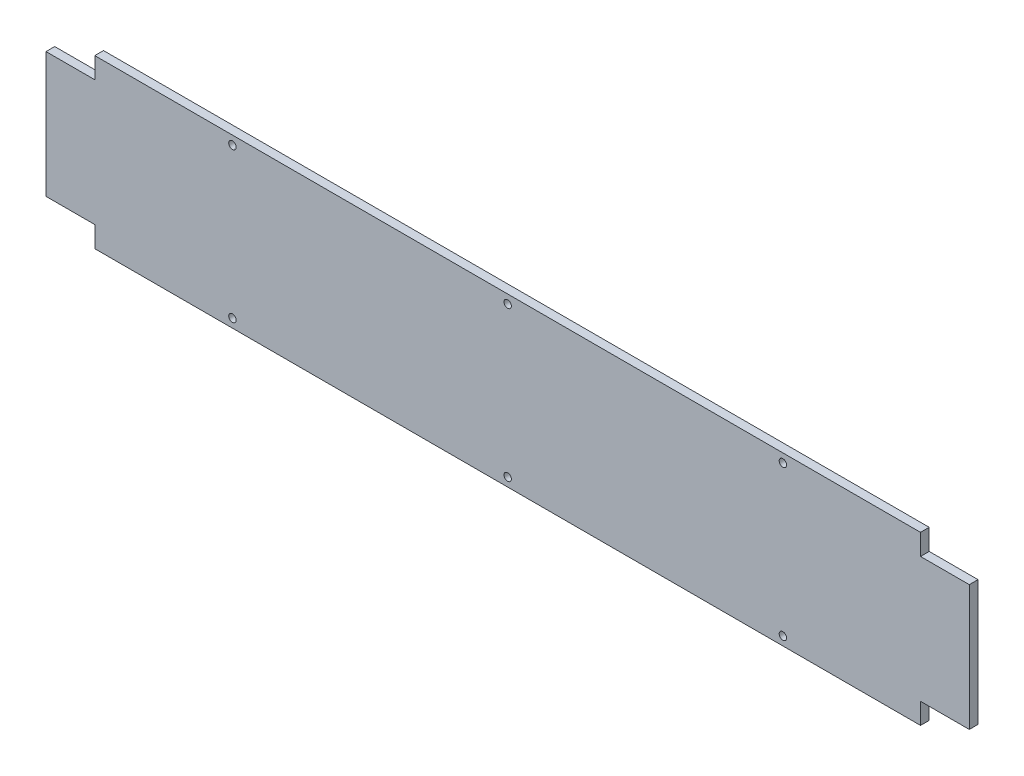
ISO-10303-21;
HEADER;
FILE_DESCRIPTION(('STEP AP214'),'2;1');
FILE_NAME('part.step','',(''),(''),'','','');
FILE_SCHEMA(('AUTOMOTIVE_DESIGN { 1 0 10303 214 1 1 1 1 }'));
ENDSEC;
DATA;
#1=APPLICATION_CONTEXT('core data for automotive mechanical design processes');
#2=APPLICATION_PROTOCOL_DEFINITION('international standard','automotive_design',2000,#1);
#3=PRODUCT_CONTEXT('',#1,'mechanical');
#4=PRODUCT('Part','Part','',(#3));
#5=PRODUCT_RELATED_PRODUCT_CATEGORY('part','',(#4));
#6=PRODUCT_DEFINITION_FORMATION('','',#4);
#7=PRODUCT_DEFINITION_CONTEXT('part definition',#1,'design');
#8=PRODUCT_DEFINITION('design','',#6,#7);
#9=PRODUCT_DEFINITION_SHAPE('','',#8);
#10=(LENGTH_UNIT() NAMED_UNIT(*) SI_UNIT(.MILLI.,.METRE.));
#11=(NAMED_UNIT(*) PLANE_ANGLE_UNIT() SI_UNIT($,.RADIAN.));
#12=(NAMED_UNIT(*) SI_UNIT($,.STERADIAN.) SOLID_ANGLE_UNIT());
#13=UNCERTAINTY_MEASURE_WITH_UNIT(LENGTH_MEASURE(1.E-05),#10,'distance_accuracy_value','');
#14=(GEOMETRIC_REPRESENTATION_CONTEXT(3) GLOBAL_UNCERTAINTY_ASSIGNED_CONTEXT((#13)) GLOBAL_UNIT_ASSIGNED_CONTEXT((#10,
#11,#12)) REPRESENTATION_CONTEXT('',''));
#15=CARTESIAN_POINT('',(0.,0.,0.));
#16=DIRECTION('',(0.,0.,1.));
#17=DIRECTION('',(1.,0.,0.));
#18=AXIS2_PLACEMENT_3D('',#15,#16,#17);
#19=CARTESIAN_POINT('',(0.,0.,5.));
#20=DIRECTION('',(1.,0.,0.));
#21=DIRECTION('',(0.,0.,-1.));
#22=AXIS2_PLACEMENT_3D('',#19,#20,#21);
#23=PLANE('',#22);
#24=DIRECTION('',(0.,0.,1.));
#25=VECTOR('',#24,1.);
#26=CARTESIAN_POINT('',(0.,12.,0.));
#27=LINE('',#26,#25);
#28=CARTESIAN_POINT('',(0.,12.,0.));
#29=VERTEX_POINT('',#28);
#30=CARTESIAN_POINT('',(0.,12.,5.));
#31=VERTEX_POINT('',#30);
#32=EDGE_CURVE('E135',#29,#31,#27,.T.);
#33=ORIENTED_EDGE('',*,*,#32,.F.);
#34=DIRECTION('',(0.,-1.,0.));
#35=VECTOR('',#34,1.);
#36=CARTESIAN_POINT('',(0.,0.,0.));
#37=LINE('',#36,#35);
#38=CARTESIAN_POINT('',(0.,0.,0.));
#39=VERTEX_POINT('',#38);
#40=EDGE_CURVE('E188',#29,#39,#37,.T.);
#41=ORIENTED_EDGE('',*,*,#40,.T.);
#42=DIRECTION('',(0.,0.,-1.));
#43=VECTOR('',#42,1.);
#44=CARTESIAN_POINT('',(0.,0.,5.));
#45=LINE('',#44,#43);
#46=CARTESIAN_POINT('',(0.,0.,5.));
#47=VERTEX_POINT('',#46);
#48=EDGE_CURVE('E11',#47,#39,#45,.T.);
#49=ORIENTED_EDGE('',*,*,#48,.F.);
#50=DIRECTION('',(0.,-1.,0.));
#51=VECTOR('',#50,1.);
#52=CARTESIAN_POINT('',(0.,0.,5.));
#53=LINE('',#52,#51);
#54=EDGE_CURVE('E151',#31,#47,#53,.T.);
#55=ORIENTED_EDGE('',*,*,#54,.F.);
#56=EDGE_LOOP('',(#33,#41,#49,#55));
#57=FACE_BOUND('',#56,.T.);
#58=ADVANCED_FACE('F45',(#57),#23,.F.);
#59=CARTESIAN_POINT('',(474.,0.,5.));
#60=DIRECTION('',(-1.,0.,0.));
#61=DIRECTION('',(0.,0.,1.));
#62=AXIS2_PLACEMENT_3D('',#59,#60,#61);
#63=PLANE('',#62);
#64=DIRECTION('',(0.,0.,1.));
#65=VECTOR('',#64,1.);
#66=CARTESIAN_POINT('',(474.,84.,0.));
#67=LINE('',#66,#65);
#68=CARTESIAN_POINT('',(474.,84.,0.));
#69=VERTEX_POINT('',#68);
#70=CARTESIAN_POINT('',(474.,84.,5.));
#71=VERTEX_POINT('',#70);
#72=EDGE_CURVE('E241',#69,#71,#67,.T.);
#73=ORIENTED_EDGE('',*,*,#72,.F.);
#74=DIRECTION('',(0.,1.,0.));
#75=VECTOR('',#74,1.);
#76=CARTESIAN_POINT('',(474.,0.,0.));
#77=LINE('',#76,#75);
#78=CARTESIAN_POINT('',(474.,96.,0.));
#79=VERTEX_POINT('',#78);
#80=EDGE_CURVE('E191',#69,#79,#77,.T.);
#81=ORIENTED_EDGE('',*,*,#80,.T.);
#82=DIRECTION('',(0.,0.,-1.));
#83=VECTOR('',#82,1.);
#84=CARTESIAN_POINT('',(474.,96.,5.));
#85=LINE('',#84,#83);
#86=CARTESIAN_POINT('',(474.,96.,5.));
#87=VERTEX_POINT('',#86);
#88=EDGE_CURVE('E198',#87,#79,#85,.T.);
#89=ORIENTED_EDGE('',*,*,#88,.F.);
#90=DIRECTION('',(0.,1.,0.));
#91=VECTOR('',#90,1.);
#92=CARTESIAN_POINT('',(474.,0.,5.));
#93=LINE('',#92,#91);
#94=EDGE_CURVE('E174',#71,#87,#93,.T.);
#95=ORIENTED_EDGE('',*,*,#94,.F.);
#96=EDGE_LOOP('',(#73,#81,#89,#95));
#97=FACE_BOUND('',#96,.T.);
#98=ADVANCED_FACE('F320',(#97),#63,.F.);
#99=CARTESIAN_POINT('',(0.,96.,0.));
#100=VERTEX_POINT('',#99);
#101=CARTESIAN_POINT('',(0.,84.,0.));
#102=VERTEX_POINT('',#101);
#103=EDGE_CURVE('E183',#100,#102,#37,.T.);
#104=ORIENTED_EDGE('',*,*,#103,.T.);
#105=DIRECTION('',(0.,0.,1.));
#106=VECTOR('',#105,1.);
#107=CARTESIAN_POINT('',(0.,84.,0.));
#108=LINE('',#107,#106);
#109=CARTESIAN_POINT('',(0.,84.,5.));
#110=VERTEX_POINT('',#109);
#111=EDGE_CURVE('E334',#102,#110,#108,.T.);
#112=ORIENTED_EDGE('',*,*,#111,.T.);
#113=CARTESIAN_POINT('',(0.,96.,5.));
#114=VERTEX_POINT('',#113);
#115=EDGE_CURVE('E160',#114,#110,#53,.T.);
#116=ORIENTED_EDGE('',*,*,#115,.F.);
#117=DIRECTION('',(0.,0.,-1.));
#118=VECTOR('',#117,1.);
#119=CARTESIAN_POINT('',(0.,96.,5.));
#120=LINE('',#119,#118);
#121=EDGE_CURVE('E182',#114,#100,#120,.T.);
#122=ORIENTED_EDGE('',*,*,#121,.T.);
#123=EDGE_LOOP('',(#104,#112,#116,#122));
#124=FACE_BOUND('',#123,.T.);
#125=ADVANCED_FACE('F47',(#124),#23,.F.);
#126=CARTESIAN_POINT('',(0.,0.,5.));
#127=DIRECTION('',(0.,1.,0.));
#128=DIRECTION('',(0.,0.,1.));
#129=AXIS2_PLACEMENT_3D('',#126,#127,#128);
#130=PLANE('',#129);
#131=DIRECTION('',(1.,0.,0.));
#132=VECTOR('',#131,1.);
#133=CARTESIAN_POINT('',(0.,0.,0.));
#134=LINE('',#133,#132);
#135=CARTESIAN_POINT('',(474.,0.,0.));
#136=VERTEX_POINT('',#135);
#137=EDGE_CURVE('E187',#39,#136,#134,.T.);
#138=ORIENTED_EDGE('',*,*,#137,.T.);
#139=DIRECTION('',(0.,0.,-1.));
#140=VECTOR('',#139,1.);
#141=CARTESIAN_POINT('',(474.,0.,5.));
#142=LINE('',#141,#140);
#143=CARTESIAN_POINT('',(474.,0.,5.));
#144=VERTEX_POINT('',#143);
#145=EDGE_CURVE('E54',#144,#136,#142,.T.);
#146=ORIENTED_EDGE('',*,*,#145,.F.);
#147=DIRECTION('',(1.,0.,0.));
#148=VECTOR('',#147,1.);
#149=CARTESIAN_POINT('',(0.,0.,5.));
#150=LINE('',#149,#148);
#151=EDGE_CURVE('E165',#47,#144,#150,.T.);
#152=ORIENTED_EDGE('',*,*,#151,.F.);
#153=ORIENTED_EDGE('',*,*,#48,.T.);
#154=EDGE_LOOP('',(#138,#146,#152,#153));
#155=FACE_BOUND('',#154,.T.);
#156=ADVANCED_FACE('F328',(#155),#130,.F.);
#157=CARTESIAN_POINT('',(474.,12.,0.));
#158=VERTEX_POINT('',#157);
#159=EDGE_CURVE('E166',#136,#158,#77,.T.);
#160=ORIENTED_EDGE('',*,*,#159,.T.);
#161=DIRECTION('',(0.,0.,1.));
#162=VECTOR('',#161,1.);
#163=CARTESIAN_POINT('',(474.,12.,0.));
#164=LINE('',#163,#162);
#165=CARTESIAN_POINT('',(474.,12.,5.));
#166=VERTEX_POINT('',#165);
#167=EDGE_CURVE('E235',#158,#166,#164,.T.);
#168=ORIENTED_EDGE('',*,*,#167,.T.);
#169=EDGE_CURVE('E175',#144,#166,#93,.T.);
#170=ORIENTED_EDGE('',*,*,#169,.F.);
#171=ORIENTED_EDGE('',*,*,#145,.T.);
#172=EDGE_LOOP('',(#160,#168,#170,#171));
#173=FACE_BOUND('',#172,.T.);
#174=ADVANCED_FACE('F207',(#173),#63,.F.);
#175=CARTESIAN_POINT('',(0.,96.,5.));
#176=DIRECTION('',(0.,-1.,0.));
#177=DIRECTION('',(0.,0.,-1.));
#178=AXIS2_PLACEMENT_3D('',#175,#176,#177);
#179=PLANE('',#178);
#180=DIRECTION('',(-1.,0.,0.));
#181=VECTOR('',#180,1.);
#182=CARTESIAN_POINT('',(0.,96.,0.));
#183=LINE('',#182,#181);
#184=EDGE_CURVE('E161',#79,#100,#183,.T.);
#185=ORIENTED_EDGE('',*,*,#184,.T.);
#186=ORIENTED_EDGE('',*,*,#121,.F.);
#187=DIRECTION('',(-1.,0.,0.));
#188=VECTOR('',#187,1.);
#189=CARTESIAN_POINT('',(0.,96.,5.));
#190=LINE('',#189,#188);
#191=EDGE_CURVE('E179',#87,#114,#190,.T.);
#192=ORIENTED_EDGE('',*,*,#191,.F.);
#193=ORIENTED_EDGE('',*,*,#88,.T.);
#194=EDGE_LOOP('',(#185,#186,#192,#193));
#195=FACE_BOUND('',#194,.T.);
#196=ADVANCED_FACE('F304',(#195),#179,.F.);
#197=CARTESIAN_POINT('',(0.,0.,5.));
#198=DIRECTION('',(0.,0.,-1.));
#199=DIRECTION('',(-1.,0.,0.));
#200=AXIS2_PLACEMENT_3D('',#197,#198,#199);
#201=PLANE('',#200);
#202=CARTESIAN_POINT('',(79.,5.,5.));
#203=DIRECTION('',(0.,0.,1.));
#204=DIRECTION('',(-1.,0.,0.));
#205=AXIS2_PLACEMENT_3D('',#202,#203,#204);
#206=CIRCLE('',#205,2.125);
#207=CARTESIAN_POINT('',(76.875,5.,5.));
#208=VERTEX_POINT('',#207);
#209=EDGE_CURVE('E285',#208,#208,#206,.T.);
#210=ORIENTED_EDGE('',*,*,#209,.F.);
#211=EDGE_LOOP('',(#210));
#212=FACE_BOUND('',#211,.T.);
#213=CARTESIAN_POINT('',(237.,5.,5.));
#214=DIRECTION('',(0.,0.,1.));
#215=DIRECTION('',(-1.,0.,0.));
#216=AXIS2_PLACEMENT_3D('',#213,#214,#215);
#217=CIRCLE('',#216,2.12499999999998);
#218=CARTESIAN_POINT('',(234.875,5.,5.));
#219=VERTEX_POINT('',#218);
#220=EDGE_CURVE('E277',#219,#219,#217,.T.);
#221=ORIENTED_EDGE('',*,*,#220,.F.);
#222=EDGE_LOOP('',(#221));
#223=FACE_BOUND('',#222,.T.);
#224=CARTESIAN_POINT('',(395.,5.,5.));
#225=DIRECTION('',(0.,0.,1.));
#226=DIRECTION('',(-1.,0.,0.));
#227=AXIS2_PLACEMENT_3D('',#224,#225,#226);
#228=CIRCLE('',#227,2.125);
#229=CARTESIAN_POINT('',(392.875,5.,5.));
#230=VERTEX_POINT('',#229);
#231=EDGE_CURVE('E269',#230,#230,#228,.T.);
#232=ORIENTED_EDGE('',*,*,#231,.F.);
#233=EDGE_LOOP('',(#232));
#234=FACE_BOUND('',#233,.T.);
#235=CARTESIAN_POINT('',(395.,91.,5.));
#236=DIRECTION('',(0.,0.,1.));
#237=DIRECTION('',(1.,0.,0.));
#238=AXIS2_PLACEMENT_3D('',#235,#236,#237);
#239=CIRCLE('',#238,2.125);
#240=CARTESIAN_POINT('',(397.125,91.,5.));
#241=VERTEX_POINT('',#240);
#242=EDGE_CURVE('E261',#241,#241,#239,.T.);
#243=ORIENTED_EDGE('',*,*,#242,.F.);
#244=EDGE_LOOP('',(#243));
#245=FACE_BOUND('',#244,.T.);
#246=CARTESIAN_POINT('',(237.,91.,5.));
#247=DIRECTION('',(0.,0.,1.));
#248=DIRECTION('',(1.,0.,0.));
#249=AXIS2_PLACEMENT_3D('',#246,#247,#248);
#250=CIRCLE('',#249,2.12499999999998);
#251=CARTESIAN_POINT('',(239.125,91.,5.));
#252=VERTEX_POINT('',#251);
#253=EDGE_CURVE('E253',#252,#252,#250,.T.);
#254=ORIENTED_EDGE('',*,*,#253,.F.);
#255=EDGE_LOOP('',(#254));
#256=FACE_BOUND('',#255,.T.);
#257=CARTESIAN_POINT('',(79.,91.,5.));
#258=DIRECTION('',(0.,0.,1.));
#259=DIRECTION('',(1.,0.,0.));
#260=AXIS2_PLACEMENT_3D('',#257,#258,#259);
#261=CIRCLE('',#260,2.125);
#262=CARTESIAN_POINT('',(81.125,91.,5.));
#263=VERTEX_POINT('',#262);
#264=EDGE_CURVE('E170',#263,#263,#261,.T.);
#265=ORIENTED_EDGE('',*,*,#264,.F.);
#266=EDGE_LOOP('',(#265));
#267=FACE_BOUND('',#266,.T.);
#268=ORIENTED_EDGE('',*,*,#115,.T.);
#269=DIRECTION('',(-1.,0.,0.));
#270=VECTOR('',#269,1.);
#271=CARTESIAN_POINT('',(0.,84.,5.));
#272=LINE('',#271,#270);
#273=CARTESIAN_POINT('',(-28.,84.,5.));
#274=VERTEX_POINT('',#273);
#275=EDGE_CURVE('E61',#110,#274,#272,.T.);
#276=ORIENTED_EDGE('',*,*,#275,.T.);
#277=DIRECTION('',(0.,-1.,0.));
#278=VECTOR('',#277,1.);
#279=CARTESIAN_POINT('',(-28.,84.,5.));
#280=LINE('',#279,#278);
#281=CARTESIAN_POINT('',(-28.,12.,5.));
#282=VERTEX_POINT('',#281);
#283=EDGE_CURVE('E154',#274,#282,#280,.T.);
#284=ORIENTED_EDGE('',*,*,#283,.T.);
#285=DIRECTION('',(1.,0.,0.));
#286=VECTOR('',#285,1.);
#287=CARTESIAN_POINT('',(0.,12.,5.));
#288=LINE('',#287,#286);
#289=EDGE_CURVE('E138',#282,#31,#288,.T.);
#290=ORIENTED_EDGE('',*,*,#289,.T.);
#291=ORIENTED_EDGE('',*,*,#54,.T.);
#292=ORIENTED_EDGE('',*,*,#151,.T.);
#293=ORIENTED_EDGE('',*,*,#169,.T.);
#294=DIRECTION('',(1.,0.,0.));
#295=VECTOR('',#294,1.);
#296=CARTESIAN_POINT('',(474.,12.,5.));
#297=LINE('',#296,#295);
#298=CARTESIAN_POINT('',(502.,12.,5.));
#299=VERTEX_POINT('',#298);
#300=EDGE_CURVE('E69',#166,#299,#297,.T.);
#301=ORIENTED_EDGE('',*,*,#300,.T.);
#302=DIRECTION('',(0.,1.,0.));
#303=VECTOR('',#302,1.);
#304=CARTESIAN_POINT('',(502.,84.,5.));
#305=LINE('',#304,#303);
#306=CARTESIAN_POINT('',(502.,84.,5.));
#307=VERTEX_POINT('',#306);
#308=EDGE_CURVE('E228',#299,#307,#305,.T.);
#309=ORIENTED_EDGE('',*,*,#308,.T.);
#310=DIRECTION('',(-1.,0.,0.));
#311=VECTOR('',#310,1.);
#312=CARTESIAN_POINT('',(474.,84.,5.));
#313=LINE('',#312,#311);
#314=EDGE_CURVE('E221',#307,#71,#313,.T.);
#315=ORIENTED_EDGE('',*,*,#314,.T.);
#316=ORIENTED_EDGE('',*,*,#94,.T.);
#317=ORIENTED_EDGE('',*,*,#191,.T.);
#318=EDGE_LOOP('',(#268,#276,#284,#290,#291,#292,#293,#301,#309,#315,#316,#317));
#319=FACE_BOUND('',#318,.T.);
#320=ADVANCED_FACE('F150',(#212,#223,#234,#245,#256,#267,#319),#201,.F.);
#321=CARTESIAN_POINT('',(0.,0.,0.));
#322=DIRECTION('',(0.,0.,-1.));
#323=DIRECTION('',(-1.,0.,0.));
#324=AXIS2_PLACEMENT_3D('',#321,#322,#323);
#325=PLANE('',#324);
#326=CARTESIAN_POINT('',(79.,5.,0.));
#327=DIRECTION('',(0.,0.,1.));
#328=DIRECTION('',(-1.,0.,0.));
#329=AXIS2_PLACEMENT_3D('',#326,#327,#328);
#330=CIRCLE('',#329,2.125);
#331=CARTESIAN_POINT('',(76.875,5.,0.));
#332=VERTEX_POINT('',#331);
#333=EDGE_CURVE('E244',#332,#332,#330,.T.);
#334=ORIENTED_EDGE('',*,*,#333,.T.);
#335=EDGE_LOOP('',(#334));
#336=FACE_BOUND('',#335,.T.);
#337=CARTESIAN_POINT('',(237.,5.,0.));
#338=DIRECTION('',(0.,0.,1.));
#339=DIRECTION('',(-1.,0.,0.));
#340=AXIS2_PLACEMENT_3D('',#337,#338,#339);
#341=CIRCLE('',#340,2.12499999999998);
#342=CARTESIAN_POINT('',(234.875,5.,0.));
#343=VERTEX_POINT('',#342);
#344=EDGE_CURVE('E281',#343,#343,#341,.T.);
#345=ORIENTED_EDGE('',*,*,#344,.T.);
#346=EDGE_LOOP('',(#345));
#347=FACE_BOUND('',#346,.T.);
#348=CARTESIAN_POINT('',(395.,5.,0.));
#349=DIRECTION('',(0.,0.,1.));
#350=DIRECTION('',(-1.,0.,0.));
#351=AXIS2_PLACEMENT_3D('',#348,#349,#350);
#352=CIRCLE('',#351,2.125);
#353=CARTESIAN_POINT('',(392.875,5.,0.));
#354=VERTEX_POINT('',#353);
#355=EDGE_CURVE('E273',#354,#354,#352,.T.);
#356=ORIENTED_EDGE('',*,*,#355,.T.);
#357=EDGE_LOOP('',(#356));
#358=FACE_BOUND('',#357,.T.);
#359=CARTESIAN_POINT('',(395.,91.,0.));
#360=DIRECTION('',(0.,0.,1.));
#361=DIRECTION('',(1.,0.,0.));
#362=AXIS2_PLACEMENT_3D('',#359,#360,#361);
#363=CIRCLE('',#362,2.125);
#364=CARTESIAN_POINT('',(397.125,91.,0.));
#365=VERTEX_POINT('',#364);
#366=EDGE_CURVE('E265',#365,#365,#363,.T.);
#367=ORIENTED_EDGE('',*,*,#366,.T.);
#368=EDGE_LOOP('',(#367));
#369=FACE_BOUND('',#368,.T.);
#370=CARTESIAN_POINT('',(237.,91.,0.));
#371=DIRECTION('',(0.,0.,1.));
#372=DIRECTION('',(1.,0.,0.));
#373=AXIS2_PLACEMENT_3D('',#370,#371,#372);
#374=CIRCLE('',#373,2.12499999999998);
#375=CARTESIAN_POINT('',(239.125,91.,0.));
#376=VERTEX_POINT('',#375);
#377=EDGE_CURVE('E257',#376,#376,#374,.T.);
#378=ORIENTED_EDGE('',*,*,#377,.T.);
#379=EDGE_LOOP('',(#378));
#380=FACE_BOUND('',#379,.T.);
#381=CARTESIAN_POINT('',(79.,91.,0.));
#382=DIRECTION('',(0.,0.,1.));
#383=DIRECTION('',(1.,0.,0.));
#384=AXIS2_PLACEMENT_3D('',#381,#382,#383);
#385=CIRCLE('',#384,2.125);
#386=CARTESIAN_POINT('',(81.125,91.,0.));
#387=VERTEX_POINT('',#386);
#388=EDGE_CURVE('E291',#387,#387,#385,.T.);
#389=ORIENTED_EDGE('',*,*,#388,.T.);
#390=EDGE_LOOP('',(#389));
#391=FACE_BOUND('',#390,.T.);
#392=ORIENTED_EDGE('',*,*,#103,.F.);
#393=ORIENTED_EDGE('',*,*,#184,.F.);
#394=ORIENTED_EDGE('',*,*,#80,.F.);
#395=DIRECTION('',(-1.,0.,0.));
#396=VECTOR('',#395,1.);
#397=CARTESIAN_POINT('',(474.,84.,0.));
#398=LINE('',#397,#396);
#399=CARTESIAN_POINT('',(502.,84.,0.));
#400=VERTEX_POINT('',#399);
#401=EDGE_CURVE('E225',#400,#69,#398,.T.);
#402=ORIENTED_EDGE('',*,*,#401,.F.);
#403=DIRECTION('',(0.,1.,0.));
#404=VECTOR('',#403,1.);
#405=CARTESIAN_POINT('',(502.,84.,0.));
#406=LINE('',#405,#404);
#407=CARTESIAN_POINT('',(502.,12.,0.));
#408=VERTEX_POINT('',#407);
#409=EDGE_CURVE('E219',#408,#400,#406,.T.);
#410=ORIENTED_EDGE('',*,*,#409,.F.);
#411=DIRECTION('',(1.,0.,0.));
#412=VECTOR('',#411,1.);
#413=CARTESIAN_POINT('',(474.,12.,0.));
#414=LINE('',#413,#412);
#415=EDGE_CURVE('E216',#158,#408,#414,.T.);
#416=ORIENTED_EDGE('',*,*,#415,.F.);
#417=ORIENTED_EDGE('',*,*,#159,.F.);
#418=ORIENTED_EDGE('',*,*,#137,.F.);
#419=ORIENTED_EDGE('',*,*,#40,.F.);
#420=DIRECTION('',(1.,0.,0.));
#421=VECTOR('',#420,1.);
#422=CARTESIAN_POINT('',(0.,12.,0.));
#423=LINE('',#422,#421);
#424=CARTESIAN_POINT('',(-28.,12.,0.));
#425=VERTEX_POINT('',#424);
#426=EDGE_CURVE('E140',#425,#29,#423,.T.);
#427=ORIENTED_EDGE('',*,*,#426,.F.);
#428=DIRECTION('',(0.,-1.,0.));
#429=VECTOR('',#428,1.);
#430=CARTESIAN_POINT('',(-28.,84.,0.));
#431=LINE('',#430,#429);
#432=CARTESIAN_POINT('',(-28.,84.,0.));
#433=VERTEX_POINT('',#432);
#434=EDGE_CURVE('E342',#433,#425,#431,.T.);
#435=ORIENTED_EDGE('',*,*,#434,.F.);
#436=DIRECTION('',(-1.,0.,0.));
#437=VECTOR('',#436,1.);
#438=CARTESIAN_POINT('',(0.,84.,0.));
#439=LINE('',#438,#437);
#440=EDGE_CURVE('E156',#102,#433,#439,.T.);
#441=ORIENTED_EDGE('',*,*,#440,.F.);
#442=EDGE_LOOP('',(#392,#393,#394,#402,#410,#416,#417,#418,#419,#427,#435,#441));
#443=FACE_BOUND('',#442,.T.);
#444=ADVANCED_FACE('F213',(#336,#347,#358,#369,#380,#391,#443),#325,.T.);
#445=CARTESIAN_POINT('',(79.,91.,0.));
#446=DIRECTION('',(0.,0.,1.));
#447=DIRECTION('',(1.,0.,0.));
#448=AXIS2_PLACEMENT_3D('',#445,#446,#447);
#449=CYLINDRICAL_SURFACE('',#448,2.125);
#450=ORIENTED_EDGE('',*,*,#388,.F.);
#451=EDGE_LOOP('',(#450));
#452=FACE_BOUND('',#451,.T.);
#453=ORIENTED_EDGE('',*,*,#264,.T.);
#454=EDGE_LOOP('',(#453));
#455=FACE_BOUND('',#454,.T.);
#456=ADVANCED_FACE('F301',(#452,#455),#449,.F.);
#457=CARTESIAN_POINT('',(237.,91.,0.));
#458=DIRECTION('',(0.,0.,1.));
#459=DIRECTION('',(1.,0.,0.));
#460=AXIS2_PLACEMENT_3D('',#457,#458,#459);
#461=CYLINDRICAL_SURFACE('',#460,2.12499999999998);
#462=ORIENTED_EDGE('',*,*,#377,.F.);
#463=EDGE_LOOP('',(#462));
#464=FACE_BOUND('',#463,.T.);
#465=ORIENTED_EDGE('',*,*,#253,.T.);
#466=EDGE_LOOP('',(#465));
#467=FACE_BOUND('',#466,.T.);
#468=ADVANCED_FACE('F383',(#464,#467),#461,.F.);
#469=CARTESIAN_POINT('',(395.,91.,0.));
#470=DIRECTION('',(0.,0.,1.));
#471=DIRECTION('',(1.,0.,0.));
#472=AXIS2_PLACEMENT_3D('',#469,#470,#471);
#473=CYLINDRICAL_SURFACE('',#472,2.125);
#474=ORIENTED_EDGE('',*,*,#366,.F.);
#475=EDGE_LOOP('',(#474));
#476=FACE_BOUND('',#475,.T.);
#477=ORIENTED_EDGE('',*,*,#242,.T.);
#478=EDGE_LOOP('',(#477));
#479=FACE_BOUND('',#478,.T.);
#480=ADVANCED_FACE('F386',(#476,#479),#473,.F.);
#481=CARTESIAN_POINT('',(395.,5.,0.));
#482=DIRECTION('',(0.,0.,1.));
#483=DIRECTION('',(1.,0.,0.));
#484=AXIS2_PLACEMENT_3D('',#481,#482,#483);
#485=CYLINDRICAL_SURFACE('',#484,2.125);
#486=ORIENTED_EDGE('',*,*,#355,.F.);
#487=EDGE_LOOP('',(#486));
#488=FACE_BOUND('',#487,.T.);
#489=ORIENTED_EDGE('',*,*,#231,.T.);
#490=EDGE_LOOP('',(#489));
#491=FACE_BOUND('',#490,.T.);
#492=ADVANCED_FACE('F390',(#488,#491),#485,.F.);
#493=CARTESIAN_POINT('',(237.,5.,0.));
#494=DIRECTION('',(0.,0.,1.));
#495=DIRECTION('',(1.,0.,0.));
#496=AXIS2_PLACEMENT_3D('',#493,#494,#495);
#497=CYLINDRICAL_SURFACE('',#496,2.12499999999998);
#498=ORIENTED_EDGE('',*,*,#344,.F.);
#499=EDGE_LOOP('',(#498));
#500=FACE_BOUND('',#499,.T.);
#501=ORIENTED_EDGE('',*,*,#220,.T.);
#502=EDGE_LOOP('',(#501));
#503=FACE_BOUND('',#502,.T.);
#504=ADVANCED_FACE('F394',(#500,#503),#497,.F.);
#505=CARTESIAN_POINT('',(79.,5.,0.));
#506=DIRECTION('',(0.,0.,1.));
#507=DIRECTION('',(1.,0.,0.));
#508=AXIS2_PLACEMENT_3D('',#505,#506,#507);
#509=CYLINDRICAL_SURFACE('',#508,2.125);
#510=ORIENTED_EDGE('',*,*,#333,.F.);
#511=EDGE_LOOP('',(#510));
#512=FACE_BOUND('',#511,.T.);
#513=ORIENTED_EDGE('',*,*,#209,.T.);
#514=EDGE_LOOP('',(#513));
#515=FACE_BOUND('',#514,.T.);
#516=ADVANCED_FACE('F398',(#512,#515),#509,.F.);
#517=CARTESIAN_POINT('',(474.,84.,0.));
#518=DIRECTION('',(0.,1.,0.));
#519=DIRECTION('',(-1.,0.,0.));
#520=AXIS2_PLACEMENT_3D('',#517,#518,#519);
#521=PLANE('',#520);
#522=ORIENTED_EDGE('',*,*,#314,.F.);
#523=DIRECTION('',(0.,0.,1.));
#524=VECTOR('',#523,1.);
#525=CARTESIAN_POINT('',(502.,84.,0.));
#526=LINE('',#525,#524);
#527=EDGE_CURVE('E245',#400,#307,#526,.T.);
#528=ORIENTED_EDGE('',*,*,#527,.F.);
#529=ORIENTED_EDGE('',*,*,#401,.T.);
#530=ORIENTED_EDGE('',*,*,#72,.T.);
#531=EDGE_LOOP('',(#522,#528,#529,#530));
#532=FACE_BOUND('',#531,.T.);
#533=ADVANCED_FACE('F368',(#532),#521,.T.);
#534=CARTESIAN_POINT('',(502.,84.,0.));
#535=DIRECTION('',(1.,0.,0.));
#536=DIRECTION('',(0.,0.,-1.));
#537=AXIS2_PLACEMENT_3D('',#534,#535,#536);
#538=PLANE('',#537);
#539=ORIENTED_EDGE('',*,*,#308,.F.);
#540=DIRECTION('',(0.,0.,1.));
#541=VECTOR('',#540,1.);
#542=CARTESIAN_POINT('',(502.,12.,0.));
#543=LINE('',#542,#541);
#544=EDGE_CURVE('E248',#408,#299,#543,.T.);
#545=ORIENTED_EDGE('',*,*,#544,.F.);
#546=ORIENTED_EDGE('',*,*,#409,.T.);
#547=ORIENTED_EDGE('',*,*,#527,.T.);
#548=EDGE_LOOP('',(#539,#545,#546,#547));
#549=FACE_BOUND('',#548,.T.);
#550=ADVANCED_FACE('F371',(#549),#538,.T.);
#551=CARTESIAN_POINT('',(474.,12.,0.));
#552=DIRECTION('',(0.,-1.,0.));
#553=DIRECTION('',(1.,0.,0.));
#554=AXIS2_PLACEMENT_3D('',#551,#552,#553);
#555=PLANE('',#554);
#556=ORIENTED_EDGE('',*,*,#300,.F.);
#557=ORIENTED_EDGE('',*,*,#167,.F.);
#558=ORIENTED_EDGE('',*,*,#415,.T.);
#559=ORIENTED_EDGE('',*,*,#544,.T.);
#560=EDGE_LOOP('',(#556,#557,#558,#559));
#561=FACE_BOUND('',#560,.T.);
#562=ADVANCED_FACE('F372',(#561),#555,.T.);
#563=CARTESIAN_POINT('',(0.,12.,0.));
#564=DIRECTION('',(0.,-1.,0.));
#565=DIRECTION('',(0.,0.,-1.));
#566=AXIS2_PLACEMENT_3D('',#563,#564,#565);
#567=PLANE('',#566);
#568=ORIENTED_EDGE('',*,*,#289,.F.);
#569=DIRECTION('',(0.,0.,1.));
#570=VECTOR('',#569,1.);
#571=CARTESIAN_POINT('',(-28.,12.,0.));
#572=LINE('',#571,#570);
#573=EDGE_CURVE('E145',#425,#282,#572,.T.);
#574=ORIENTED_EDGE('',*,*,#573,.F.);
#575=ORIENTED_EDGE('',*,*,#426,.T.);
#576=ORIENTED_EDGE('',*,*,#32,.T.);
#577=EDGE_LOOP('',(#568,#574,#575,#576));
#578=FACE_BOUND('',#577,.T.);
#579=ADVANCED_FACE('F137',(#578),#567,.T.);
#580=CARTESIAN_POINT('',(-28.,84.,0.));
#581=DIRECTION('',(-1.,0.,0.));
#582=DIRECTION('',(0.,-1.,0.));
#583=AXIS2_PLACEMENT_3D('',#580,#581,#582);
#584=PLANE('',#583);
#585=ORIENTED_EDGE('',*,*,#283,.F.);
#586=DIRECTION('',(0.,0.,1.));
#587=VECTOR('',#586,1.);
#588=CARTESIAN_POINT('',(-28.,84.,0.));
#589=LINE('',#588,#587);
#590=EDGE_CURVE('E355',#433,#274,#589,.T.);
#591=ORIENTED_EDGE('',*,*,#590,.F.);
#592=ORIENTED_EDGE('',*,*,#434,.T.);
#593=ORIENTED_EDGE('',*,*,#573,.T.);
#594=EDGE_LOOP('',(#585,#591,#592,#593));
#595=FACE_BOUND('',#594,.T.);
#596=ADVANCED_FACE('F360',(#595),#584,.T.);
#597=CARTESIAN_POINT('',(0.,84.,0.));
#598=DIRECTION('',(0.,1.,0.));
#599=DIRECTION('',(0.,0.,1.));
#600=AXIS2_PLACEMENT_3D('',#597,#598,#599);
#601=PLANE('',#600);
#602=ORIENTED_EDGE('',*,*,#275,.F.);
#603=ORIENTED_EDGE('',*,*,#111,.F.);
#604=ORIENTED_EDGE('',*,*,#440,.T.);
#605=ORIENTED_EDGE('',*,*,#590,.T.);
#606=EDGE_LOOP('',(#602,#603,#604,#605));
#607=FACE_BOUND('',#606,.T.);
#608=ADVANCED_FACE('F359',(#607),#601,.T.);
#609=CLOSED_SHELL('',(#58,#98,#125,#156,#174,#196,#320,#444,#456,#468,#480,#492,#504,#516,#533,
#550,#562,#579,#596,#608));
#610=MANIFOLD_SOLID_BREP('B2',#609);
#611=ADVANCED_BREP_SHAPE_REPRESENTATION('',(#18,#610),#14);
#612=SHAPE_DEFINITION_REPRESENTATION(#9,#611);
ENDSEC;
END-ISO-10303-21;
